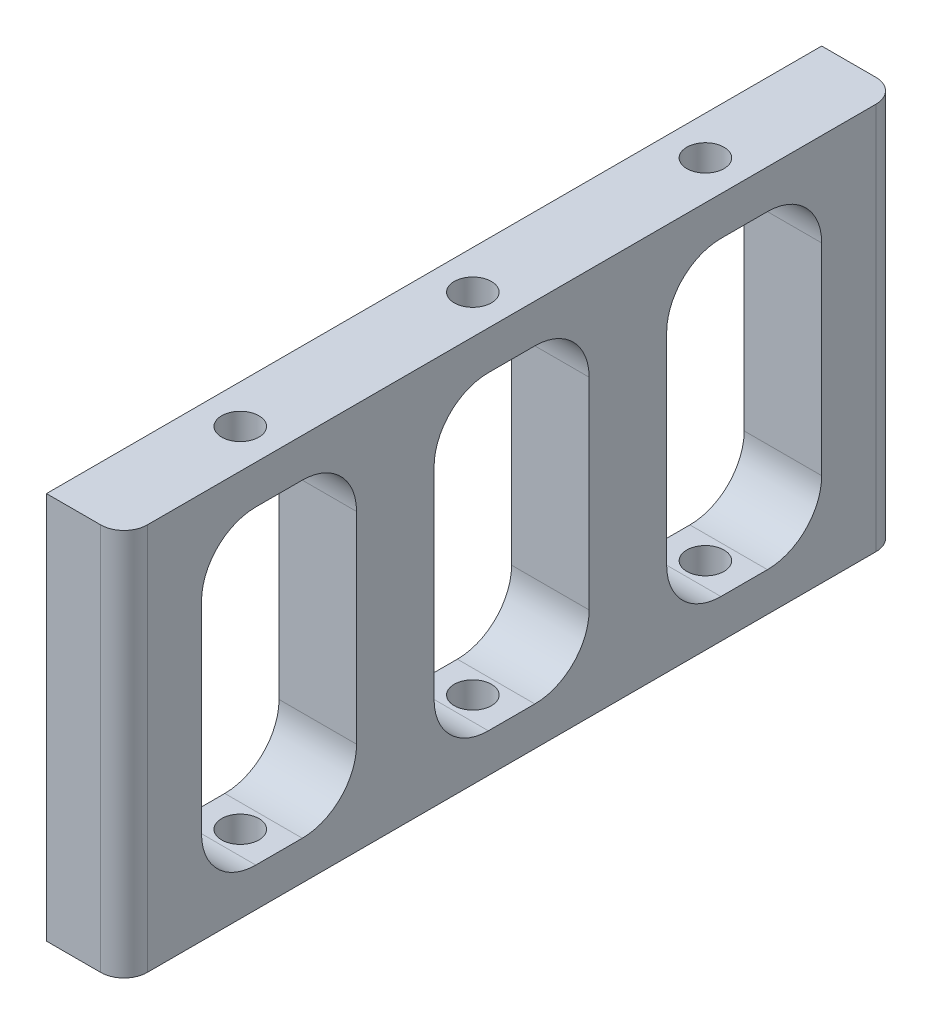
ISO-10303-21;
HEADER;
FILE_DESCRIPTION(('STEP AP214'),'2;1');
FILE_NAME('part.step','',(''),(''),'','','');
FILE_SCHEMA(('AUTOMOTIVE_DESIGN { 1 0 10303 214 1 1 1 1 }'));
ENDSEC;
DATA;
#1=APPLICATION_CONTEXT('core data for automotive mechanical design processes');
#2=APPLICATION_PROTOCOL_DEFINITION('international standard','automotive_design',2000,#1);
#3=PRODUCT_CONTEXT('',#1,'mechanical');
#4=PRODUCT('Part','Part','',(#3));
#5=PRODUCT_RELATED_PRODUCT_CATEGORY('part','',(#4));
#6=PRODUCT_DEFINITION_FORMATION('','',#4);
#7=PRODUCT_DEFINITION_CONTEXT('part definition',#1,'design');
#8=PRODUCT_DEFINITION('design','',#6,#7);
#9=PRODUCT_DEFINITION_SHAPE('','',#8);
#10=(LENGTH_UNIT() NAMED_UNIT(*) SI_UNIT(.MILLI.,.METRE.));
#11=(NAMED_UNIT(*) PLANE_ANGLE_UNIT() SI_UNIT($,.RADIAN.));
#12=(NAMED_UNIT(*) SI_UNIT($,.STERADIAN.) SOLID_ANGLE_UNIT());
#13=UNCERTAINTY_MEASURE_WITH_UNIT(LENGTH_MEASURE(1.E-05),#10,'distance_accuracy_value','');
#14=(GEOMETRIC_REPRESENTATION_CONTEXT(3) GLOBAL_UNCERTAINTY_ASSIGNED_CONTEXT((#13)) GLOBAL_UNIT_ASSIGNED_CONTEXT((#10,
#11,#12)) REPRESENTATION_CONTEXT('',''));
#15=CARTESIAN_POINT('',(0.,0.,0.));
#16=DIRECTION('',(0.,0.,1.));
#17=DIRECTION('',(1.,0.,0.));
#18=AXIS2_PLACEMENT_3D('',#15,#16,#17);
#19=CARTESIAN_POINT('',(10.,50.,0.));
#20=DIRECTION('',(0.,1.,0.));
#21=DIRECTION('',(0.,0.,1.));
#22=AXIS2_PLACEMENT_3D('',#19,#20,#21);
#23=PLANE('',#22);
#24=CARTESIAN_POINT('',(5.,50.,-20.));
#25=DIRECTION('',(0.,-1.,0.));
#26=DIRECTION('',(0.,0.,-1.));
#27=AXIS2_PLACEMENT_3D('',#24,#25,#26);
#28=CIRCLE('',#27,2.4);
#29=CARTESIAN_POINT('',(5.,50.,-22.4));
#30=VERTEX_POINT('',#29);
#31=EDGE_CURVE('E292',#30,#30,#28,.T.);
#32=ORIENTED_EDGE('',*,*,#31,.T.);
#33=EDGE_LOOP('',(#32));
#34=FACE_BOUND('',#33,.T.);
#35=CARTESIAN_POINT('',(5.,50.,-50.));
#36=DIRECTION('',(0.,-1.,0.));
#37=DIRECTION('',(0.,0.,-1.));
#38=AXIS2_PLACEMENT_3D('',#35,#36,#37);
#39=CIRCLE('',#38,2.4);
#40=CARTESIAN_POINT('',(5.,50.,-52.4));
#41=VERTEX_POINT('',#40);
#42=EDGE_CURVE('E1108',#41,#41,#39,.T.);
#43=ORIENTED_EDGE('',*,*,#42,.T.);
#44=EDGE_LOOP('',(#43));
#45=FACE_BOUND('',#44,.T.);
#46=CARTESIAN_POINT('',(5.00000000000003,50.,-80.));
#47=DIRECTION('',(0.,-1.,0.));
#48=DIRECTION('',(0.,0.,-1.));
#49=AXIS2_PLACEMENT_3D('',#46,#47,#48);
#50=CIRCLE('',#49,2.39999999999997);
#51=CARTESIAN_POINT('',(5.00000000000003,50.,-82.4));
#52=VERTEX_POINT('',#51);
#53=EDGE_CURVE('E1118',#52,#52,#50,.T.);
#54=ORIENTED_EDGE('',*,*,#53,.T.);
#55=EDGE_LOOP('',(#54));
#56=FACE_BOUND('',#55,.T.);
#57=DIRECTION('',(0.,0.,-1.));
#58=VECTOR('',#57,1.);
#59=CARTESIAN_POINT('',(10.,50.,0.));
#60=LINE('',#59,#58);
#61=CARTESIAN_POINT('',(10.,50.,-3.));
#62=VERTEX_POINT('',#61);
#63=CARTESIAN_POINT('',(10.,50.,-97.));
#64=VERTEX_POINT('',#63);
#65=EDGE_CURVE('E485',#62,#64,#60,.T.);
#66=ORIENTED_EDGE('',*,*,#65,.T.);
#67=CARTESIAN_POINT('',(7.,50.,-97.));
#68=DIRECTION('',(0.,1.,0.));
#69=DIRECTION('',(0.,0.,1.));
#70=AXIS2_PLACEMENT_3D('',#67,#68,#69);
#71=CIRCLE('',#70,3.);
#72=CARTESIAN_POINT('',(7.,50.,-100.));
#73=VERTEX_POINT('',#72);
#74=EDGE_CURVE('E468',#64,#73,#71,.T.);
#75=ORIENTED_EDGE('',*,*,#74,.T.);
#76=DIRECTION('',(-1.,0.,0.));
#77=VECTOR('',#76,1.);
#78=CARTESIAN_POINT('',(10.,50.,-100.));
#79=LINE('',#78,#77);
#80=CARTESIAN_POINT('',(0.,50.,-100.));
#81=VERTEX_POINT('',#80);
#82=EDGE_CURVE('E258',#73,#81,#79,.T.);
#83=ORIENTED_EDGE('',*,*,#82,.T.);
#84=DIRECTION('',(0.,0.,-1.));
#85=VECTOR('',#84,1.);
#86=CARTESIAN_POINT('',(0.,50.,0.));
#87=LINE('',#86,#85);
#88=CARTESIAN_POINT('',(0.,50.,0.));
#89=VERTEX_POINT('',#88);
#90=EDGE_CURVE('E256',#89,#81,#87,.T.);
#91=ORIENTED_EDGE('',*,*,#90,.F.);
#92=DIRECTION('',(-1.,0.,0.));
#93=VECTOR('',#92,1.);
#94=CARTESIAN_POINT('',(10.,50.,0.));
#95=LINE('',#94,#93);
#96=CARTESIAN_POINT('',(7.,50.,0.));
#97=VERTEX_POINT('',#96);
#98=EDGE_CURVE('E244',#97,#89,#95,.T.);
#99=ORIENTED_EDGE('',*,*,#98,.F.);
#100=CARTESIAN_POINT('',(7.,50.,-3.));
#101=DIRECTION('',(0.,1.,0.));
#102=DIRECTION('',(0.,0.,1.));
#103=AXIS2_PLACEMENT_3D('',#100,#101,#102);
#104=CIRCLE('',#103,3.);
#105=EDGE_CURVE('E465',#97,#62,#104,.T.);
#106=ORIENTED_EDGE('',*,*,#105,.T.);
#107=EDGE_LOOP('',(#66,#75,#83,#91,#99,#106));
#108=FACE_BOUND('',#107,.T.);
#109=ADVANCED_FACE('F44',(#34,#45,#56,#108),#23,.T.);
#110=CARTESIAN_POINT('',(10.,0.,0.));
#111=DIRECTION('',(0.,0.,1.));
#112=DIRECTION('',(1.,0.,0.));
#113=AXIS2_PLACEMENT_3D('',#110,#111,#112);
#114=PLANE('',#113);
#115=DIRECTION('',(-1.,0.,0.));
#116=VECTOR('',#115,1.);
#117=CARTESIAN_POINT('',(10.,0.,0.));
#118=LINE('',#117,#116);
#119=CARTESIAN_POINT('',(7.,0.,0.));
#120=VERTEX_POINT('',#119);
#121=CARTESIAN_POINT('',(0.,0.,0.));
#122=VERTEX_POINT('',#121);
#123=EDGE_CURVE('E253',#120,#122,#118,.T.);
#124=ORIENTED_EDGE('',*,*,#123,.F.);
#125=DIRECTION('',(0.,1.,0.));
#126=VECTOR('',#125,1.);
#127=CARTESIAN_POINT('',(7.,0.,0.));
#128=LINE('',#127,#126);
#129=EDGE_CURVE('E11',#120,#97,#128,.T.);
#130=ORIENTED_EDGE('',*,*,#129,.T.);
#131=ORIENTED_EDGE('',*,*,#98,.T.);
#132=DIRECTION('',(0.,1.,0.));
#133=VECTOR('',#132,1.);
#134=CARTESIAN_POINT('',(0.,0.,0.));
#135=LINE('',#134,#133);
#136=EDGE_CURVE('E248',#122,#89,#135,.T.);
#137=ORIENTED_EDGE('',*,*,#136,.F.);
#138=EDGE_LOOP('',(#124,#130,#131,#137));
#139=FACE_BOUND('',#138,.T.);
#140=ADVANCED_FACE('F246',(#139),#114,.T.);
#141=CARTESIAN_POINT('',(10.,0.,0.));
#142=DIRECTION('',(0.,1.,0.));
#143=DIRECTION('',(0.,0.,1.));
#144=AXIS2_PLACEMENT_3D('',#141,#142,#143);
#145=PLANE('',#144);
#146=CARTESIAN_POINT('',(5.,0.,-20.));
#147=DIRECTION('',(0.,-1.,0.));
#148=DIRECTION('',(0.,0.,-1.));
#149=AXIS2_PLACEMENT_3D('',#146,#147,#148);
#150=CIRCLE('',#149,2.4);
#151=CARTESIAN_POINT('',(5.,0.,-22.4));
#152=VERTEX_POINT('',#151);
#153=EDGE_CURVE('E1100',#152,#152,#150,.T.);
#154=ORIENTED_EDGE('',*,*,#153,.F.);
#155=EDGE_LOOP('',(#154));
#156=FACE_BOUND('',#155,.T.);
#157=CARTESIAN_POINT('',(5.,0.,-50.));
#158=DIRECTION('',(0.,-1.,0.));
#159=DIRECTION('',(0.,0.,-1.));
#160=AXIS2_PLACEMENT_3D('',#157,#158,#159);
#161=CIRCLE('',#160,2.4);
#162=CARTESIAN_POINT('',(5.,0.,-52.4));
#163=VERTEX_POINT('',#162);
#164=EDGE_CURVE('E1102',#163,#163,#161,.T.);
#165=ORIENTED_EDGE('',*,*,#164,.F.);
#166=EDGE_LOOP('',(#165));
#167=FACE_BOUND('',#166,.T.);
#168=CARTESIAN_POINT('',(5.00000000000003,0.,-80.));
#169=DIRECTION('',(0.,-1.,0.));
#170=DIRECTION('',(0.,0.,-1.));
#171=AXIS2_PLACEMENT_3D('',#168,#169,#170);
#172=CIRCLE('',#171,2.39999999999997);
#173=CARTESIAN_POINT('',(5.00000000000003,0.,-82.4));
#174=VERTEX_POINT('',#173);
#175=EDGE_CURVE('E1114',#174,#174,#172,.T.);
#176=ORIENTED_EDGE('',*,*,#175,.F.);
#177=EDGE_LOOP('',(#176));
#178=FACE_BOUND('',#177,.T.);
#179=DIRECTION('',(-1.,0.,0.));
#180=VECTOR('',#179,1.);
#181=CARTESIAN_POINT('',(10.,0.,-100.));
#182=LINE('',#181,#180);
#183=CARTESIAN_POINT('',(7.,0.,-100.));
#184=VERTEX_POINT('',#183);
#185=CARTESIAN_POINT('',(0.,0.,-100.));
#186=VERTEX_POINT('',#185);
#187=EDGE_CURVE('E281',#184,#186,#182,.T.);
#188=ORIENTED_EDGE('',*,*,#187,.F.);
#189=CARTESIAN_POINT('',(7.,0.,-97.));
#190=DIRECTION('',(0.,1.,0.));
#191=DIRECTION('',(0.,0.,1.));
#192=AXIS2_PLACEMENT_3D('',#189,#190,#191);
#193=CIRCLE('',#192,3.);
#194=CARTESIAN_POINT('',(10.,0.,-97.));
#195=VERTEX_POINT('',#194);
#196=EDGE_CURVE('E53',#184,#195,#193,.F.);
#197=ORIENTED_EDGE('',*,*,#196,.T.);
#198=DIRECTION('',(0.,0.,-1.));
#199=VECTOR('',#198,1.);
#200=CARTESIAN_POINT('',(10.,0.,0.));
#201=LINE('',#200,#199);
#202=CARTESIAN_POINT('',(10.,0.,-3.));
#203=VERTEX_POINT('',#202);
#204=EDGE_CURVE('E282',#203,#195,#201,.T.);
#205=ORIENTED_EDGE('',*,*,#204,.F.);
#206=CARTESIAN_POINT('',(7.,0.,-3.));
#207=DIRECTION('',(0.,1.,0.));
#208=DIRECTION('',(0.,0.,1.));
#209=AXIS2_PLACEMENT_3D('',#206,#207,#208);
#210=CIRCLE('',#209,3.);
#211=EDGE_CURVE('E60',#203,#120,#210,.F.);
#212=ORIENTED_EDGE('',*,*,#211,.T.);
#213=ORIENTED_EDGE('',*,*,#123,.T.);
#214=DIRECTION('',(0.,0.,-1.));
#215=VECTOR('',#214,1.);
#216=CARTESIAN_POINT('',(0.,0.,0.));
#217=LINE('',#216,#215);
#218=EDGE_CURVE('E268',#122,#186,#217,.T.);
#219=ORIENTED_EDGE('',*,*,#218,.T.);
#220=EDGE_LOOP('',(#188,#197,#205,#212,#213,#219));
#221=FACE_BOUND('',#220,.T.);
#222=ADVANCED_FACE('F477',(#156,#167,#178,#221),#145,.F.);
#223=CARTESIAN_POINT('',(10.,5.,0.));
#224=DIRECTION('',(0.,1.,0.));
#225=DIRECTION('',(0.,0.,1.));
#226=AXIS2_PLACEMENT_3D('',#223,#224,#225);
#227=PLANE('',#226);
#228=CARTESIAN_POINT('',(5.,5.,-20.));
#229=DIRECTION('',(0.,1.,0.));
#230=DIRECTION('',(0.,0.,1.));
#231=AXIS2_PLACEMENT_3D('',#228,#229,#230);
#232=CIRCLE('',#231,2.4);
#233=CARTESIAN_POINT('',(5.,5.,-17.6));
#234=VERTEX_POINT('',#233);
#235=EDGE_CURVE('E302',#234,#234,#232,.T.);
#236=ORIENTED_EDGE('',*,*,#235,.F.);
#237=EDGE_LOOP('',(#236));
#238=FACE_BOUND('',#237,.T.);
#239=DIRECTION('',(0.,0.,-1.));
#240=VECTOR('',#239,1.);
#241=CARTESIAN_POINT('',(10.,5.,0.));
#242=LINE('',#241,#240);
#243=CARTESIAN_POINT('',(10.,5.,-17.));
#244=VERTEX_POINT('',#243);
#245=CARTESIAN_POINT('',(10.,5.,-23.));
#246=VERTEX_POINT('',#245);
#247=EDGE_CURVE('E546',#244,#246,#242,.T.);
#248=ORIENTED_EDGE('',*,*,#247,.T.);
#249=DIRECTION('',(-1.,0.,0.));
#250=VECTOR('',#249,1.);
#251=CARTESIAN_POINT('',(10.,5.,-23.));
#252=LINE('',#251,#250);
#253=CARTESIAN_POINT('',(0.,5.,-23.));
#254=VERTEX_POINT('',#253);
#255=EDGE_CURVE('E319',#246,#254,#252,.T.);
#256=ORIENTED_EDGE('',*,*,#255,.T.);
#257=DIRECTION('',(0.,0.,-1.));
#258=VECTOR('',#257,1.);
#259=CARTESIAN_POINT('',(0.,5.,0.));
#260=LINE('',#259,#258);
#261=CARTESIAN_POINT('',(0.,5.,-17.));
#262=VERTEX_POINT('',#261);
#263=EDGE_CURVE('E505',#262,#254,#260,.T.);
#264=ORIENTED_EDGE('',*,*,#263,.F.);
#265=DIRECTION('',(-1.,0.,0.));
#266=VECTOR('',#265,1.);
#267=CARTESIAN_POINT('',(10.,5.,-17.));
#268=LINE('',#267,#266);
#269=EDGE_CURVE('E316',#262,#244,#268,.F.);
#270=ORIENTED_EDGE('',*,*,#269,.T.);
#271=EDGE_LOOP('',(#248,#256,#264,#270));
#272=FACE_BOUND('',#271,.T.);
#273=ADVANCED_FACE('F549',(#238,#272),#227,.T.);
#274=CARTESIAN_POINT('',(10.,0.,-9.99999999999999));
#275=DIRECTION('',(0.,0.,-1.));
#276=DIRECTION('',(0.,1.,0.));
#277=AXIS2_PLACEMENT_3D('',#274,#275,#276);
#278=PLANE('',#277);
#279=DIRECTION('',(0.,-1.,0.));
#280=VECTOR('',#279,1.);
#281=CARTESIAN_POINT('',(10.,0.,-9.99999999999999));
#282=LINE('',#281,#280);
#283=CARTESIAN_POINT('',(10.,38.,-9.99999999999999));
#284=VERTEX_POINT('',#283);
#285=CARTESIAN_POINT('',(10.,12.,-9.99999999999999));
#286=VERTEX_POINT('',#285);
#287=EDGE_CURVE('E554',#284,#286,#282,.T.);
#288=ORIENTED_EDGE('',*,*,#287,.T.);
#289=DIRECTION('',(-1.,0.,0.));
#290=VECTOR('',#289,1.);
#291=CARTESIAN_POINT('',(0.,12.,-9.99999999999999));
#292=LINE('',#291,#290);
#293=CARTESIAN_POINT('',(0.,12.,-9.99999999999999));
#294=VERTEX_POINT('',#293);
#295=EDGE_CURVE('E375',#286,#294,#292,.T.);
#296=ORIENTED_EDGE('',*,*,#295,.T.);
#297=DIRECTION('',(0.,-1.,0.));
#298=VECTOR('',#297,1.);
#299=CARTESIAN_POINT('',(0.,0.,-9.99999999999999));
#300=LINE('',#299,#298);
#301=CARTESIAN_POINT('',(0.,38.,-9.99999999999999));
#302=VERTEX_POINT('',#301);
#303=EDGE_CURVE('E516',#302,#294,#300,.T.);
#304=ORIENTED_EDGE('',*,*,#303,.F.);
#305=DIRECTION('',(-1.,0.,0.));
#306=VECTOR('',#305,1.);
#307=CARTESIAN_POINT('',(10.,38.,-9.99999999999999));
#308=LINE('',#307,#306);
#309=EDGE_CURVE('E372',#302,#284,#308,.F.);
#310=ORIENTED_EDGE('',*,*,#309,.T.);
#311=EDGE_LOOP('',(#288,#296,#304,#310));
#312=FACE_BOUND('',#311,.T.);
#313=ADVANCED_FACE('F622',(#312),#278,.T.);
#314=CARTESIAN_POINT('',(10.,45.,0.));
#315=DIRECTION('',(0.,1.,0.));
#316=DIRECTION('',(0.,0.,1.));
#317=AXIS2_PLACEMENT_3D('',#314,#315,#316);
#318=PLANE('',#317);
#319=CARTESIAN_POINT('',(5.,45.,-20.));
#320=DIRECTION('',(0.,1.,0.));
#321=DIRECTION('',(0.,0.,1.));
#322=AXIS2_PLACEMENT_3D('',#319,#320,#321);
#323=CIRCLE('',#322,2.4);
#324=CARTESIAN_POINT('',(5.,45.,-17.6));
#325=VERTEX_POINT('',#324);
#326=EDGE_CURVE('E298',#325,#325,#323,.T.);
#327=ORIENTED_EDGE('',*,*,#326,.T.);
#328=EDGE_LOOP('',(#327));
#329=FACE_BOUND('',#328,.T.);
#330=DIRECTION('',(0.,0.,-1.));
#331=VECTOR('',#330,1.);
#332=CARTESIAN_POINT('',(10.,45.,0.));
#333=LINE('',#332,#331);
#334=CARTESIAN_POINT('',(10.,45.,-17.));
#335=VERTEX_POINT('',#334);
#336=CARTESIAN_POINT('',(10.,45.,-23.));
#337=VERTEX_POINT('',#336);
#338=EDGE_CURVE('E495',#335,#337,#333,.T.);
#339=ORIENTED_EDGE('',*,*,#338,.F.);
#340=DIRECTION('',(-1.,0.,0.));
#341=VECTOR('',#340,1.);
#342=CARTESIAN_POINT('',(10.,45.,-17.));
#343=LINE('',#342,#341);
#344=CARTESIAN_POINT('',(0.,45.,-17.));
#345=VERTEX_POINT('',#344);
#346=EDGE_CURVE('E382',#335,#345,#343,.T.);
#347=ORIENTED_EDGE('',*,*,#346,.T.);
#348=DIRECTION('',(0.,0.,-1.));
#349=VECTOR('',#348,1.);
#350=CARTESIAN_POINT('',(0.,45.,0.));
#351=LINE('',#350,#349);
#352=CARTESIAN_POINT('',(0.,45.,-23.));
#353=VERTEX_POINT('',#352);
#354=EDGE_CURVE('E512',#345,#353,#351,.T.);
#355=ORIENTED_EDGE('',*,*,#354,.T.);
#356=DIRECTION('',(-1.,0.,0.));
#357=VECTOR('',#356,1.);
#358=CARTESIAN_POINT('',(10.,45.,-23.));
#359=LINE('',#358,#357);
#360=EDGE_CURVE('E379',#353,#337,#359,.F.);
#361=ORIENTED_EDGE('',*,*,#360,.T.);
#362=EDGE_LOOP('',(#339,#347,#355,#361));
#363=FACE_BOUND('',#362,.T.);
#364=ADVANCED_FACE('F631',(#329,#363),#318,.F.);
#365=CARTESIAN_POINT('',(5.00000000000003,5.,-80.));
#366=DIRECTION('',(0.,1.,0.));
#367=DIRECTION('',(0.,0.,1.));
#368=AXIS2_PLACEMENT_3D('',#365,#366,#367);
#369=CIRCLE('',#368,2.39999999999997);
#370=CARTESIAN_POINT('',(5.00000000000003,5.,-77.6));
#371=VERTEX_POINT('',#370);
#372=EDGE_CURVE('E297',#371,#371,#369,.T.);
#373=ORIENTED_EDGE('',*,*,#372,.F.);
#374=EDGE_LOOP('',(#373));
#375=FACE_BOUND('',#374,.T.);
#376=CARTESIAN_POINT('',(10.,5.,-77.));
#377=VERTEX_POINT('',#376);
#378=CARTESIAN_POINT('',(10.,5.,-83.));
#379=VERTEX_POINT('',#378);
#380=EDGE_CURVE('E557',#377,#379,#242,.T.);
#381=ORIENTED_EDGE('',*,*,#380,.T.);
#382=DIRECTION('',(-1.,0.,0.));
#383=VECTOR('',#382,1.);
#384=CARTESIAN_POINT('',(10.,5.,-83.));
#385=LINE('',#384,#383);
#386=CARTESIAN_POINT('',(0.,5.,-83.));
#387=VERTEX_POINT('',#386);
#388=EDGE_CURVE('E347',#379,#387,#385,.T.);
#389=ORIENTED_EDGE('',*,*,#388,.T.);
#390=CARTESIAN_POINT('',(0.,5.,-77.));
#391=VERTEX_POINT('',#390);
#392=EDGE_CURVE('E499',#391,#387,#260,.T.);
#393=ORIENTED_EDGE('',*,*,#392,.F.);
#394=DIRECTION('',(-1.,0.,0.));
#395=VECTOR('',#394,1.);
#396=CARTESIAN_POINT('',(10.,5.,-77.));
#397=LINE('',#396,#395);
#398=EDGE_CURVE('E344',#391,#377,#397,.F.);
#399=ORIENTED_EDGE('',*,*,#398,.T.);
#400=EDGE_LOOP('',(#381,#389,#393,#399));
#401=FACE_BOUND('',#400,.T.);
#402=ADVANCED_FACE('F660',(#375,#401),#227,.T.);
#403=CARTESIAN_POINT('',(10.,0.,-70.));
#404=DIRECTION('',(0.,0.,-1.));
#405=DIRECTION('',(-1.,0.,0.));
#406=AXIS2_PLACEMENT_3D('',#403,#404,#405);
#407=PLANE('',#406);
#408=DIRECTION('',(0.,-1.,0.));
#409=VECTOR('',#408,1.);
#410=CARTESIAN_POINT('',(10.,0.,-70.));
#411=LINE('',#410,#409);
#412=CARTESIAN_POINT('',(10.,38.,-70.));
#413=VERTEX_POINT('',#412);
#414=CARTESIAN_POINT('',(10.,12.,-70.));
#415=VERTEX_POINT('',#414);
#416=EDGE_CURVE('E571',#413,#415,#411,.T.);
#417=ORIENTED_EDGE('',*,*,#416,.T.);
#418=DIRECTION('',(-1.,0.,0.));
#419=VECTOR('',#418,1.);
#420=CARTESIAN_POINT('',(0.,12.,-70.));
#421=LINE('',#420,#419);
#422=CARTESIAN_POINT('',(0.,12.,-70.));
#423=VERTEX_POINT('',#422);
#424=EDGE_CURVE('E354',#415,#423,#421,.T.);
#425=ORIENTED_EDGE('',*,*,#424,.T.);
#426=DIRECTION('',(0.,-1.,0.));
#427=VECTOR('',#426,1.);
#428=CARTESIAN_POINT('',(0.,0.,-70.));
#429=LINE('',#428,#427);
#430=CARTESIAN_POINT('',(0.,38.,-70.));
#431=VERTEX_POINT('',#430);
#432=EDGE_CURVE('E503',#431,#423,#429,.T.);
#433=ORIENTED_EDGE('',*,*,#432,.F.);
#434=DIRECTION('',(-1.,0.,0.));
#435=VECTOR('',#434,1.);
#436=CARTESIAN_POINT('',(10.,38.,-70.));
#437=LINE('',#436,#435);
#438=EDGE_CURVE('E351',#431,#413,#437,.F.);
#439=ORIENTED_EDGE('',*,*,#438,.T.);
#440=EDGE_LOOP('',(#417,#425,#433,#439));
#441=FACE_BOUND('',#440,.T.);
#442=ADVANCED_FACE('F672',(#441),#407,.T.);
#443=CARTESIAN_POINT('',(5.00000000000003,45.,-80.));
#444=DIRECTION('',(0.,1.,0.));
#445=DIRECTION('',(0.,0.,1.));
#446=AXIS2_PLACEMENT_3D('',#443,#444,#445);
#447=CIRCLE('',#446,2.39999999999997);
#448=CARTESIAN_POINT('',(5.00000000000003,45.,-77.6));
#449=VERTEX_POINT('',#448);
#450=EDGE_CURVE('E293',#449,#449,#447,.T.);
#451=ORIENTED_EDGE('',*,*,#450,.T.);
#452=EDGE_LOOP('',(#451));
#453=FACE_BOUND('',#452,.T.);
#454=CARTESIAN_POINT('',(0.,45.,-77.));
#455=VERTEX_POINT('',#454);
#456=CARTESIAN_POINT('',(0.,45.,-83.));
#457=VERTEX_POINT('',#456);
#458=EDGE_CURVE('E517',#455,#457,#351,.T.);
#459=ORIENTED_EDGE('',*,*,#458,.T.);
#460=DIRECTION('',(-1.,0.,0.));
#461=VECTOR('',#460,1.);
#462=CARTESIAN_POINT('',(10.,45.,-83.));
#463=LINE('',#462,#461);
#464=CARTESIAN_POINT('',(10.,45.,-83.));
#465=VERTEX_POINT('',#464);
#466=EDGE_CURVE('E341',#457,#465,#463,.F.);
#467=ORIENTED_EDGE('',*,*,#466,.T.);
#468=CARTESIAN_POINT('',(10.,45.,-77.));
#469=VERTEX_POINT('',#468);
#470=EDGE_CURVE('E562',#469,#465,#333,.T.);
#471=ORIENTED_EDGE('',*,*,#470,.F.);
#472=DIRECTION('',(-1.,0.,0.));
#473=VECTOR('',#472,1.);
#474=CARTESIAN_POINT('',(10.,45.,-77.));
#475=LINE('',#474,#473);
#476=EDGE_CURVE('E337',#469,#455,#475,.T.);
#477=ORIENTED_EDGE('',*,*,#476,.T.);
#478=EDGE_LOOP('',(#459,#467,#471,#477));
#479=FACE_BOUND('',#478,.T.);
#480=ADVANCED_FACE('F662',(#453,#479),#318,.F.);
#481=CARTESIAN_POINT('',(5.,5.,-50.));
#482=DIRECTION('',(0.,1.,0.));
#483=DIRECTION('',(0.,0.,1.));
#484=AXIS2_PLACEMENT_3D('',#481,#482,#483);
#485=CIRCLE('',#484,2.4);
#486=CARTESIAN_POINT('',(5.,5.,-47.6));
#487=VERTEX_POINT('',#486);
#488=EDGE_CURVE('E291',#487,#487,#485,.T.);
#489=ORIENTED_EDGE('',*,*,#488,.F.);
#490=EDGE_LOOP('',(#489));
#491=FACE_BOUND('',#490,.T.);
#492=CARTESIAN_POINT('',(0.,5.,-47.));
#493=VERTEX_POINT('',#492);
#494=CARTESIAN_POINT('',(0.,5.,-53.));
#495=VERTEX_POINT('',#494);
#496=EDGE_CURVE('E506',#493,#495,#260,.T.);
#497=ORIENTED_EDGE('',*,*,#496,.F.);
#498=DIRECTION('',(-1.,0.,0.));
#499=VECTOR('',#498,1.);
#500=CARTESIAN_POINT('',(10.,5.,-47.));
#501=LINE('',#500,#499);
#502=CARTESIAN_POINT('',(10.,5.,-47.));
#503=VERTEX_POINT('',#502);
#504=EDGE_CURVE('E313',#493,#503,#501,.F.);
#505=ORIENTED_EDGE('',*,*,#504,.T.);
#506=CARTESIAN_POINT('',(10.,5.,-53.));
#507=VERTEX_POINT('',#506);
#508=EDGE_CURVE('E278',#503,#507,#242,.T.);
#509=ORIENTED_EDGE('',*,*,#508,.T.);
#510=DIRECTION('',(-1.,0.,0.));
#511=VECTOR('',#510,1.);
#512=CARTESIAN_POINT('',(10.,5.,-53.));
#513=LINE('',#512,#511);
#514=EDGE_CURVE('E309',#507,#495,#513,.T.);
#515=ORIENTED_EDGE('',*,*,#514,.T.);
#516=EDGE_LOOP('',(#497,#505,#509,#515));
#517=FACE_BOUND('',#516,.T.);
#518=ADVANCED_FACE('F609',(#491,#517),#227,.T.);
#519=CARTESIAN_POINT('',(10.,0.,-40.));
#520=DIRECTION('',(0.,0.,-1.));
#521=DIRECTION('',(-1.,0.,0.));
#522=AXIS2_PLACEMENT_3D('',#519,#520,#521);
#523=PLANE('',#522);
#524=DIRECTION('',(0.,-1.,0.));
#525=VECTOR('',#524,1.);
#526=CARTESIAN_POINT('',(10.,0.,-40.));
#527=LINE('',#526,#525);
#528=CARTESIAN_POINT('',(10.,38.,-40.));
#529=VERTEX_POINT('',#528);
#530=CARTESIAN_POINT('',(10.,12.,-40.));
#531=VERTEX_POINT('',#530);
#532=EDGE_CURVE('E568',#529,#531,#527,.T.);
#533=ORIENTED_EDGE('',*,*,#532,.T.);
#534=DIRECTION('',(-1.,0.,0.));
#535=VECTOR('',#534,1.);
#536=CARTESIAN_POINT('',(0.,12.,-40.));
#537=LINE('',#536,#535);
#538=CARTESIAN_POINT('',(0.,12.,-40.));
#539=VERTEX_POINT('',#538);
#540=EDGE_CURVE('E305',#531,#539,#537,.T.);
#541=ORIENTED_EDGE('',*,*,#540,.T.);
#542=DIRECTION('',(0.,-1.,0.));
#543=VECTOR('',#542,1.);
#544=CARTESIAN_POINT('',(0.,0.,-40.));
#545=LINE('',#544,#543);
#546=CARTESIAN_POINT('',(0.,38.,-40.));
#547=VERTEX_POINT('',#546);
#548=EDGE_CURVE('E507',#547,#539,#545,.T.);
#549=ORIENTED_EDGE('',*,*,#548,.F.);
#550=DIRECTION('',(-1.,0.,0.));
#551=VECTOR('',#550,1.);
#552=CARTESIAN_POINT('',(10.,38.,-40.));
#553=LINE('',#552,#551);
#554=EDGE_CURVE('E252',#547,#529,#553,.F.);
#555=ORIENTED_EDGE('',*,*,#554,.T.);
#556=EDGE_LOOP('',(#533,#541,#549,#555));
#557=FACE_BOUND('',#556,.T.);
#558=ADVANCED_FACE('F596',(#557),#523,.T.);
#559=CARTESIAN_POINT('',(5.,45.,-50.));
#560=DIRECTION('',(0.,1.,0.));
#561=DIRECTION('',(0.,0.,1.));
#562=AXIS2_PLACEMENT_3D('',#559,#560,#561);
#563=CIRCLE('',#562,2.4);
#564=CARTESIAN_POINT('',(5.,45.,-47.6));
#565=VERTEX_POINT('',#564);
#566=EDGE_CURVE('E287',#565,#565,#563,.T.);
#567=ORIENTED_EDGE('',*,*,#566,.T.);
#568=EDGE_LOOP('',(#567));
#569=FACE_BOUND('',#568,.T.);
#570=CARTESIAN_POINT('',(0.,45.,-47.));
#571=VERTEX_POINT('',#570);
#572=CARTESIAN_POINT('',(0.,45.,-53.));
#573=VERTEX_POINT('',#572);
#574=EDGE_CURVE('E511',#571,#573,#351,.T.);
#575=ORIENTED_EDGE('',*,*,#574,.T.);
#576=DIRECTION('',(-1.,0.,0.));
#577=VECTOR('',#576,1.);
#578=CARTESIAN_POINT('',(10.,45.,-53.));
#579=LINE('',#578,#577);
#580=CARTESIAN_POINT('',(10.,45.,-53.));
#581=VERTEX_POINT('',#580);
#582=EDGE_CURVE('E369',#573,#581,#579,.F.);
#583=ORIENTED_EDGE('',*,*,#582,.T.);
#584=CARTESIAN_POINT('',(10.,45.,-47.));
#585=VERTEX_POINT('',#584);
#586=EDGE_CURVE('E581',#585,#581,#333,.T.);
#587=ORIENTED_EDGE('',*,*,#586,.F.);
#588=DIRECTION('',(-1.,0.,0.));
#589=VECTOR('',#588,1.);
#590=CARTESIAN_POINT('',(10.,45.,-47.));
#591=LINE('',#590,#589);
#592=EDGE_CURVE('E365',#585,#571,#591,.T.);
#593=ORIENTED_EDGE('',*,*,#592,.T.);
#594=EDGE_LOOP('',(#575,#583,#587,#593));
#595=FACE_BOUND('',#594,.T.);
#596=ADVANCED_FACE('F657',(#569,#595),#318,.F.);
#597=CARTESIAN_POINT('',(10.,0.,-30.));
#598=DIRECTION('',(0.,0.,-1.));
#599=DIRECTION('',(0.,1.,0.));
#600=AXIS2_PLACEMENT_3D('',#597,#598,#599);
#601=PLANE('',#600);
#602=DIRECTION('',(0.,-1.,0.));
#603=VECTOR('',#602,1.);
#604=CARTESIAN_POINT('',(0.,0.,-30.));
#605=LINE('',#604,#603);
#606=CARTESIAN_POINT('',(0.,38.,-30.));
#607=VERTEX_POINT('',#606);
#608=CARTESIAN_POINT('',(0.,12.,-30.));
#609=VERTEX_POINT('',#608);
#610=EDGE_CURVE('E263',#607,#609,#605,.T.);
#611=ORIENTED_EDGE('',*,*,#610,.T.);
#612=DIRECTION('',(-1.,0.,0.));
#613=VECTOR('',#612,1.);
#614=CARTESIAN_POINT('',(10.,12.,-30.));
#615=LINE('',#614,#613);
#616=CARTESIAN_POINT('',(10.,12.,-30.));
#617=VERTEX_POINT('',#616);
#618=EDGE_CURVE('E327',#609,#617,#615,.F.);
#619=ORIENTED_EDGE('',*,*,#618,.T.);
#620=DIRECTION('',(0.,-1.,0.));
#621=VECTOR('',#620,1.);
#622=CARTESIAN_POINT('',(10.,0.,-30.));
#623=LINE('',#622,#621);
#624=CARTESIAN_POINT('',(10.,38.,-30.));
#625=VERTEX_POINT('',#624);
#626=EDGE_CURVE('E491',#625,#617,#623,.T.);
#627=ORIENTED_EDGE('',*,*,#626,.F.);
#628=DIRECTION('',(-1.,0.,0.));
#629=VECTOR('',#628,1.);
#630=CARTESIAN_POINT('',(0.,38.,-30.));
#631=LINE('',#630,#629);
#632=EDGE_CURVE('E323',#625,#607,#631,.T.);
#633=ORIENTED_EDGE('',*,*,#632,.T.);
#634=EDGE_LOOP('',(#611,#619,#627,#633));
#635=FACE_BOUND('',#634,.T.);
#636=ADVANCED_FACE('F535',(#635),#601,.F.);
#637=CARTESIAN_POINT('',(10.,0.,-90.));
#638=DIRECTION('',(0.,0.,-1.));
#639=DIRECTION('',(-1.,0.,0.));
#640=AXIS2_PLACEMENT_3D('',#637,#638,#639);
#641=PLANE('',#640);
#642=DIRECTION('',(0.,-1.,0.));
#643=VECTOR('',#642,1.);
#644=CARTESIAN_POINT('',(10.,0.,-90.));
#645=LINE('',#644,#643);
#646=CARTESIAN_POINT('',(10.,38.,-90.));
#647=VERTEX_POINT('',#646);
#648=CARTESIAN_POINT('',(10.,12.,-90.));
#649=VERTEX_POINT('',#648);
#650=EDGE_CURVE('E555',#647,#649,#645,.T.);
#651=ORIENTED_EDGE('',*,*,#650,.F.);
#652=DIRECTION('',(-1.,0.,0.));
#653=VECTOR('',#652,1.);
#654=CARTESIAN_POINT('',(0.,38.,-90.));
#655=LINE('',#654,#653);
#656=CARTESIAN_POINT('',(0.,38.,-90.));
#657=VERTEX_POINT('',#656);
#658=EDGE_CURVE('E333',#647,#657,#655,.T.);
#659=ORIENTED_EDGE('',*,*,#658,.T.);
#660=DIRECTION('',(0.,-1.,0.));
#661=VECTOR('',#660,1.);
#662=CARTESIAN_POINT('',(0.,0.,-90.));
#663=LINE('',#662,#661);
#664=CARTESIAN_POINT('',(0.,12.,-90.));
#665=VERTEX_POINT('',#664);
#666=EDGE_CURVE('E524',#657,#665,#663,.T.);
#667=ORIENTED_EDGE('',*,*,#666,.T.);
#668=DIRECTION('',(-1.,0.,0.));
#669=VECTOR('',#668,1.);
#670=CARTESIAN_POINT('',(10.,12.,-90.));
#671=LINE('',#670,#669);
#672=EDGE_CURVE('E330',#665,#649,#671,.F.);
#673=ORIENTED_EDGE('',*,*,#672,.T.);
#674=EDGE_LOOP('',(#651,#659,#667,#673));
#675=FACE_BOUND('',#674,.T.);
#676=ADVANCED_FACE('F656',(#675),#641,.F.);
#677=CARTESIAN_POINT('',(10.,0.,-60.));
#678=DIRECTION('',(0.,0.,-1.));
#679=DIRECTION('',(-1.,0.,0.));
#680=AXIS2_PLACEMENT_3D('',#677,#678,#679);
#681=PLANE('',#680);
#682=DIRECTION('',(0.,-1.,0.));
#683=VECTOR('',#682,1.);
#684=CARTESIAN_POINT('',(10.,0.,-60.));
#685=LINE('',#684,#683);
#686=CARTESIAN_POINT('',(10.,38.,-60.));
#687=VERTEX_POINT('',#686);
#688=CARTESIAN_POINT('',(10.,12.,-60.));
#689=VERTEX_POINT('',#688);
#690=EDGE_CURVE('E572',#687,#689,#685,.T.);
#691=ORIENTED_EDGE('',*,*,#690,.F.);
#692=DIRECTION('',(-1.,0.,0.));
#693=VECTOR('',#692,1.);
#694=CARTESIAN_POINT('',(0.,38.,-60.));
#695=LINE('',#694,#693);
#696=CARTESIAN_POINT('',(0.,38.,-60.));
#697=VERTEX_POINT('',#696);
#698=EDGE_CURVE('E361',#687,#697,#695,.T.);
#699=ORIENTED_EDGE('',*,*,#698,.T.);
#700=DIRECTION('',(0.,-1.,0.));
#701=VECTOR('',#700,1.);
#702=CARTESIAN_POINT('',(0.,0.,-60.));
#703=LINE('',#702,#701);
#704=CARTESIAN_POINT('',(0.,12.,-60.));
#705=VERTEX_POINT('',#704);
#706=EDGE_CURVE('E504',#697,#705,#703,.T.);
#707=ORIENTED_EDGE('',*,*,#706,.T.);
#708=DIRECTION('',(-1.,0.,0.));
#709=VECTOR('',#708,1.);
#710=CARTESIAN_POINT('',(10.,12.,-60.));
#711=LINE('',#710,#709);
#712=EDGE_CURVE('E358',#705,#689,#711,.F.);
#713=ORIENTED_EDGE('',*,*,#712,.T.);
#714=EDGE_LOOP('',(#691,#699,#707,#713));
#715=FACE_BOUND('',#714,.T.);
#716=ADVANCED_FACE('F670',(#715),#681,.F.);
#717=CARTESIAN_POINT('',(10.,0.,-100.));
#718=DIRECTION('',(0.,0.,1.));
#719=DIRECTION('',(0.,-1.,0.));
#720=AXIS2_PLACEMENT_3D('',#717,#718,#719);
#721=PLANE('',#720);
#722=ORIENTED_EDGE('',*,*,#82,.F.);
#723=DIRECTION('',(0.,1.,0.));
#724=VECTOR('',#723,1.);
#725=CARTESIAN_POINT('',(7.,0.,-100.));
#726=LINE('',#725,#724);
#727=EDGE_CURVE('E68',#73,#184,#726,.F.);
#728=ORIENTED_EDGE('',*,*,#727,.T.);
#729=ORIENTED_EDGE('',*,*,#187,.T.);
#730=DIRECTION('',(0.,1.,0.));
#731=VECTOR('',#730,1.);
#732=CARTESIAN_POINT('',(0.,0.,-100.));
#733=LINE('',#732,#731);
#734=EDGE_CURVE('E272',#186,#81,#733,.T.);
#735=ORIENTED_EDGE('',*,*,#734,.T.);
#736=EDGE_LOOP('',(#722,#728,#729,#735));
#737=FACE_BOUND('',#736,.T.);
#738=ADVANCED_FACE('F488',(#737),#721,.F.);
#739=CARTESIAN_POINT('',(10.,0.,0.));
#740=DIRECTION('',(1.,0.,0.));
#741=DIRECTION('',(0.,0.,-1.));
#742=AXIS2_PLACEMENT_3D('',#739,#740,#741);
#743=PLANE('',#742);
#744=ORIENTED_EDGE('',*,*,#508,.F.);
#745=CARTESIAN_POINT('',(10.,12.,-47.));
#746=DIRECTION('',(1.,0.,0.));
#747=DIRECTION('',(0.,0.,-1.));
#748=AXIS2_PLACEMENT_3D('',#745,#746,#747);
#749=CIRCLE('',#748,7.);
#750=EDGE_CURVE('E389',#503,#531,#749,.F.);
#751=ORIENTED_EDGE('',*,*,#750,.T.);
#752=ORIENTED_EDGE('',*,*,#532,.F.);
#753=CARTESIAN_POINT('',(10.,38.,-47.));
#754=DIRECTION('',(1.,0.,0.));
#755=DIRECTION('',(0.,0.,-1.));
#756=AXIS2_PLACEMENT_3D('',#753,#754,#755);
#757=CIRCLE('',#756,7.);
#758=EDGE_CURVE('E431',#529,#585,#757,.F.);
#759=ORIENTED_EDGE('',*,*,#758,.T.);
#760=ORIENTED_EDGE('',*,*,#586,.T.);
#761=CARTESIAN_POINT('',(10.,38.,-53.));
#762=DIRECTION('',(1.,0.,0.));
#763=DIRECTION('',(0.,0.,-1.));
#764=AXIS2_PLACEMENT_3D('',#761,#762,#763);
#765=CIRCLE('',#764,7.);
#766=EDGE_CURVE('E425',#581,#687,#765,.F.);
#767=ORIENTED_EDGE('',*,*,#766,.T.);
#768=ORIENTED_EDGE('',*,*,#690,.T.);
#769=CARTESIAN_POINT('',(10.,12.,-53.));
#770=DIRECTION('',(1.,0.,0.));
#771=DIRECTION('',(0.,0.,-1.));
#772=AXIS2_PLACEMENT_3D('',#769,#770,#771);
#773=CIRCLE('',#772,7.);
#774=EDGE_CURVE('E437',#689,#507,#773,.F.);
#775=ORIENTED_EDGE('',*,*,#774,.T.);
#776=EDGE_LOOP('',(#744,#751,#752,#759,#760,#767,#768,#775));
#777=FACE_BOUND('',#776,.T.);
#778=ORIENTED_EDGE('',*,*,#380,.F.);
#779=CARTESIAN_POINT('',(10.,12.,-77.));
#780=DIRECTION('',(1.,0.,0.));
#781=DIRECTION('',(0.,0.,-1.));
#782=AXIS2_PLACEMENT_3D('',#779,#780,#781);
#783=CIRCLE('',#782,7.);
#784=EDGE_CURVE('E413',#377,#415,#783,.F.);
#785=ORIENTED_EDGE('',*,*,#784,.T.);
#786=ORIENTED_EDGE('',*,*,#416,.F.);
#787=CARTESIAN_POINT('',(10.,38.,-77.));
#788=DIRECTION('',(1.,0.,0.));
#789=DIRECTION('',(0.,0.,-1.));
#790=AXIS2_PLACEMENT_3D('',#787,#788,#789);
#791=CIRCLE('',#790,7.);
#792=EDGE_CURVE('E419',#413,#469,#791,.F.);
#793=ORIENTED_EDGE('',*,*,#792,.T.);
#794=ORIENTED_EDGE('',*,*,#470,.T.);
#795=CARTESIAN_POINT('',(10.,38.,-83.));
#796=DIRECTION('',(1.,0.,0.));
#797=DIRECTION('',(0.,0.,-1.));
#798=AXIS2_PLACEMENT_3D('',#795,#796,#797);
#799=CIRCLE('',#798,7.);
#800=EDGE_CURVE('E401',#465,#647,#799,.F.);
#801=ORIENTED_EDGE('',*,*,#800,.T.);
#802=ORIENTED_EDGE('',*,*,#650,.T.);
#803=CARTESIAN_POINT('',(10.,12.,-83.));
#804=DIRECTION('',(1.,0.,0.));
#805=DIRECTION('',(0.,0.,-1.));
#806=AXIS2_PLACEMENT_3D('',#803,#804,#805);
#807=CIRCLE('',#806,7.);
#808=EDGE_CURVE('E407',#649,#379,#807,.F.);
#809=ORIENTED_EDGE('',*,*,#808,.T.);
#810=EDGE_LOOP('',(#778,#785,#786,#793,#794,#801,#802,#809));
#811=FACE_BOUND('',#810,.T.);
#812=ORIENTED_EDGE('',*,*,#247,.F.);
#813=CARTESIAN_POINT('',(10.,12.,-17.));
#814=DIRECTION('',(1.,0.,0.));
#815=DIRECTION('',(0.,0.,-1.));
#816=AXIS2_PLACEMENT_3D('',#813,#814,#815);
#817=CIRCLE('',#816,7.);
#818=EDGE_CURVE('E443',#244,#286,#817,.F.);
#819=ORIENTED_EDGE('',*,*,#818,.T.);
#820=ORIENTED_EDGE('',*,*,#287,.F.);
#821=CARTESIAN_POINT('',(10.,38.,-17.));
#822=DIRECTION('',(1.,0.,0.));
#823=DIRECTION('',(0.,0.,-1.));
#824=AXIS2_PLACEMENT_3D('',#821,#822,#823);
#825=CIRCLE('',#824,7.);
#826=EDGE_CURVE('E449',#284,#335,#825,.F.);
#827=ORIENTED_EDGE('',*,*,#826,.T.);
#828=ORIENTED_EDGE('',*,*,#338,.T.);
#829=CARTESIAN_POINT('',(10.,38.,-23.));
#830=DIRECTION('',(1.,0.,0.));
#831=DIRECTION('',(0.,0.,-1.));
#832=AXIS2_PLACEMENT_3D('',#829,#830,#831);
#833=CIRCLE('',#832,7.);
#834=EDGE_CURVE('E455',#337,#625,#833,.F.);
#835=ORIENTED_EDGE('',*,*,#834,.T.);
#836=ORIENTED_EDGE('',*,*,#626,.T.);
#837=CARTESIAN_POINT('',(10.,12.,-23.));
#838=DIRECTION('',(1.,0.,0.));
#839=DIRECTION('',(0.,0.,-1.));
#840=AXIS2_PLACEMENT_3D('',#837,#838,#839);
#841=CIRCLE('',#840,7.);
#842=EDGE_CURVE('E395',#617,#246,#841,.F.);
#843=ORIENTED_EDGE('',*,*,#842,.T.);
#844=EDGE_LOOP('',(#812,#819,#820,#827,#828,#835,#836,#843));
#845=FACE_BOUND('',#844,.T.);
#846=ORIENTED_EDGE('',*,*,#204,.T.);
#847=DIRECTION('',(0.,1.,0.));
#848=VECTOR('',#847,1.);
#849=CARTESIAN_POINT('',(10.,50.,-97.));
#850=LINE('',#849,#848);
#851=EDGE_CURVE('E461',#195,#64,#850,.T.);
#852=ORIENTED_EDGE('',*,*,#851,.T.);
#853=ORIENTED_EDGE('',*,*,#65,.F.);
#854=DIRECTION('',(0.,1.,0.));
#855=VECTOR('',#854,1.);
#856=CARTESIAN_POINT('',(10.,0.,-3.));
#857=LINE('',#856,#855);
#858=EDGE_CURVE('E458',#62,#203,#857,.F.);
#859=ORIENTED_EDGE('',*,*,#858,.T.);
#860=EDGE_LOOP('',(#846,#852,#853,#859));
#861=FACE_BOUND('',#860,.T.);
#862=ADVANCED_FACE('F481',(#777,#811,#845,#861),#743,.T.);
#863=CARTESIAN_POINT('',(0.,0.,0.));
#864=DIRECTION('',(1.,0.,0.));
#865=DIRECTION('',(0.,0.,-1.));
#866=AXIS2_PLACEMENT_3D('',#863,#864,#865);
#867=PLANE('',#866);
#868=ORIENTED_EDGE('',*,*,#548,.T.);
#869=CARTESIAN_POINT('',(0.,12.,-47.));
#870=DIRECTION('',(1.,0.,0.));
#871=DIRECTION('',(0.,0.,-1.));
#872=AXIS2_PLACEMENT_3D('',#869,#870,#871);
#873=CIRCLE('',#872,7.);
#874=EDGE_CURVE('E386',#539,#493,#873,.T.);
#875=ORIENTED_EDGE('',*,*,#874,.T.);
#876=ORIENTED_EDGE('',*,*,#496,.T.);
#877=CARTESIAN_POINT('',(0.,12.,-53.));
#878=DIRECTION('',(1.,0.,0.));
#879=DIRECTION('',(0.,0.,-1.));
#880=AXIS2_PLACEMENT_3D('',#877,#878,#879);
#881=CIRCLE('',#880,7.);
#882=EDGE_CURVE('E434',#495,#705,#881,.T.);
#883=ORIENTED_EDGE('',*,*,#882,.T.);
#884=ORIENTED_EDGE('',*,*,#706,.F.);
#885=CARTESIAN_POINT('',(0.,38.,-53.));
#886=DIRECTION('',(1.,0.,0.));
#887=DIRECTION('',(0.,0.,-1.));
#888=AXIS2_PLACEMENT_3D('',#885,#886,#887);
#889=CIRCLE('',#888,7.);
#890=EDGE_CURVE('E422',#697,#573,#889,.T.);
#891=ORIENTED_EDGE('',*,*,#890,.T.);
#892=ORIENTED_EDGE('',*,*,#574,.F.);
#893=CARTESIAN_POINT('',(0.,38.,-47.));
#894=DIRECTION('',(1.,0.,0.));
#895=DIRECTION('',(0.,0.,-1.));
#896=AXIS2_PLACEMENT_3D('',#893,#894,#895);
#897=CIRCLE('',#896,7.);
#898=EDGE_CURVE('E428',#571,#547,#897,.T.);
#899=ORIENTED_EDGE('',*,*,#898,.T.);
#900=EDGE_LOOP('',(#868,#875,#876,#883,#884,#891,#892,#899));
#901=FACE_BOUND('',#900,.T.);
#902=ORIENTED_EDGE('',*,*,#432,.T.);
#903=CARTESIAN_POINT('',(0.,12.,-77.));
#904=DIRECTION('',(1.,0.,0.));
#905=DIRECTION('',(0.,0.,-1.));
#906=AXIS2_PLACEMENT_3D('',#903,#904,#905);
#907=CIRCLE('',#906,7.);
#908=EDGE_CURVE('E410',#423,#391,#907,.T.);
#909=ORIENTED_EDGE('',*,*,#908,.T.);
#910=ORIENTED_EDGE('',*,*,#392,.T.);
#911=CARTESIAN_POINT('',(0.,12.,-83.));
#912=DIRECTION('',(1.,0.,0.));
#913=DIRECTION('',(0.,0.,-1.));
#914=AXIS2_PLACEMENT_3D('',#911,#912,#913);
#915=CIRCLE('',#914,7.);
#916=EDGE_CURVE('E404',#387,#665,#915,.T.);
#917=ORIENTED_EDGE('',*,*,#916,.T.);
#918=ORIENTED_EDGE('',*,*,#666,.F.);
#919=CARTESIAN_POINT('',(0.,38.,-83.));
#920=DIRECTION('',(1.,0.,0.));
#921=DIRECTION('',(0.,0.,-1.));
#922=AXIS2_PLACEMENT_3D('',#919,#920,#921);
#923=CIRCLE('',#922,7.);
#924=EDGE_CURVE('E398',#657,#457,#923,.T.);
#925=ORIENTED_EDGE('',*,*,#924,.T.);
#926=ORIENTED_EDGE('',*,*,#458,.F.);
#927=CARTESIAN_POINT('',(0.,38.,-77.));
#928=DIRECTION('',(1.,0.,0.));
#929=DIRECTION('',(0.,0.,-1.));
#930=AXIS2_PLACEMENT_3D('',#927,#928,#929);
#931=CIRCLE('',#930,7.);
#932=EDGE_CURVE('E416',#455,#431,#931,.T.);
#933=ORIENTED_EDGE('',*,*,#932,.T.);
#934=EDGE_LOOP('',(#902,#909,#910,#917,#918,#925,#926,#933));
#935=FACE_BOUND('',#934,.T.);
#936=ORIENTED_EDGE('',*,*,#303,.T.);
#937=CARTESIAN_POINT('',(0.,12.,-17.));
#938=DIRECTION('',(1.,0.,0.));
#939=DIRECTION('',(0.,0.,-1.));
#940=AXIS2_PLACEMENT_3D('',#937,#938,#939);
#941=CIRCLE('',#940,7.);
#942=EDGE_CURVE('E440',#294,#262,#941,.T.);
#943=ORIENTED_EDGE('',*,*,#942,.T.);
#944=ORIENTED_EDGE('',*,*,#263,.T.);
#945=CARTESIAN_POINT('',(0.,12.,-23.));
#946=DIRECTION('',(1.,0.,0.));
#947=DIRECTION('',(0.,0.,-1.));
#948=AXIS2_PLACEMENT_3D('',#945,#946,#947);
#949=CIRCLE('',#948,7.);
#950=EDGE_CURVE('E392',#254,#609,#949,.T.);
#951=ORIENTED_EDGE('',*,*,#950,.T.);
#952=ORIENTED_EDGE('',*,*,#610,.F.);
#953=CARTESIAN_POINT('',(0.,38.,-23.));
#954=DIRECTION('',(1.,0.,0.));
#955=DIRECTION('',(0.,0.,-1.));
#956=AXIS2_PLACEMENT_3D('',#953,#954,#955);
#957=CIRCLE('',#956,7.);
#958=EDGE_CURVE('E452',#607,#353,#957,.T.);
#959=ORIENTED_EDGE('',*,*,#958,.T.);
#960=ORIENTED_EDGE('',*,*,#354,.F.);
#961=CARTESIAN_POINT('',(0.,38.,-17.));
#962=DIRECTION('',(1.,0.,0.));
#963=DIRECTION('',(0.,0.,-1.));
#964=AXIS2_PLACEMENT_3D('',#961,#962,#963);
#965=CIRCLE('',#964,7.);
#966=EDGE_CURVE('E446',#345,#302,#965,.T.);
#967=ORIENTED_EDGE('',*,*,#966,.T.);
#968=EDGE_LOOP('',(#936,#943,#944,#951,#952,#959,#960,#967));
#969=FACE_BOUND('',#968,.T.);
#970=ORIENTED_EDGE('',*,*,#90,.T.);
#971=ORIENTED_EDGE('',*,*,#734,.F.);
#972=ORIENTED_EDGE('',*,*,#218,.F.);
#973=ORIENTED_EDGE('',*,*,#136,.T.);
#974=EDGE_LOOP('',(#970,#971,#972,#973));
#975=FACE_BOUND('',#974,.T.);
#976=ADVANCED_FACE('F266',(#901,#935,#969,#975),#867,.F.);
#977=CARTESIAN_POINT('',(5.,50.,-50.));
#978=DIRECTION('',(0.,-1.,0.));
#979=DIRECTION('',(0.,0.,-1.));
#980=AXIS2_PLACEMENT_3D('',#977,#978,#979);
#981=CYLINDRICAL_SURFACE('',#980,2.4);
#982=ORIENTED_EDGE('',*,*,#42,.F.);
#983=EDGE_LOOP('',(#982));
#984=FACE_BOUND('',#983,.T.);
#985=ORIENTED_EDGE('',*,*,#566,.F.);
#986=EDGE_LOOP('',(#985));
#987=FACE_BOUND('',#986,.T.);
#988=ADVANCED_FACE('F888',(#984,#987),#981,.F.);
#989=ORIENTED_EDGE('',*,*,#488,.T.);
#990=EDGE_LOOP('',(#989));
#991=FACE_BOUND('',#990,.T.);
#992=ORIENTED_EDGE('',*,*,#164,.T.);
#993=EDGE_LOOP('',(#992));
#994=FACE_BOUND('',#993,.T.);
#995=ADVANCED_FACE('F897',(#991,#994),#981,.F.);
#996=CARTESIAN_POINT('',(5.00000000000003,50.,-80.));
#997=DIRECTION('',(0.,-1.,0.));
#998=DIRECTION('',(0.,0.,-1.));
#999=AXIS2_PLACEMENT_3D('',#996,#997,#998);
#1000=CYLINDRICAL_SURFACE('',#999,2.39999999999997);
#1001=ORIENTED_EDGE('',*,*,#53,.F.);
#1002=EDGE_LOOP('',(#1001));
#1003=FACE_BOUND('',#1002,.T.);
#1004=ORIENTED_EDGE('',*,*,#450,.F.);
#1005=EDGE_LOOP('',(#1004));
#1006=FACE_BOUND('',#1005,.T.);
#1007=ADVANCED_FACE('F908',(#1003,#1006),#1000,.F.);
#1008=ORIENTED_EDGE('',*,*,#372,.T.);
#1009=EDGE_LOOP('',(#1008));
#1010=FACE_BOUND('',#1009,.T.);
#1011=ORIENTED_EDGE('',*,*,#175,.T.);
#1012=EDGE_LOOP('',(#1011));
#1013=FACE_BOUND('',#1012,.T.);
#1014=ADVANCED_FACE('F917',(#1010,#1013),#1000,.F.);
#1015=CARTESIAN_POINT('',(5.,50.,-20.));
#1016=DIRECTION('',(0.,-1.,0.));
#1017=DIRECTION('',(0.,0.,-1.));
#1018=AXIS2_PLACEMENT_3D('',#1015,#1016,#1017);
#1019=CYLINDRICAL_SURFACE('',#1018,2.4);
#1020=ORIENTED_EDGE('',*,*,#31,.F.);
#1021=EDGE_LOOP('',(#1020));
#1022=FACE_BOUND('',#1021,.T.);
#1023=ORIENTED_EDGE('',*,*,#326,.F.);
#1024=EDGE_LOOP('',(#1023));
#1025=FACE_BOUND('',#1024,.T.);
#1026=ADVANCED_FACE('F927',(#1022,#1025),#1019,.F.);
#1027=ORIENTED_EDGE('',*,*,#235,.T.);
#1028=EDGE_LOOP('',(#1027));
#1029=FACE_BOUND('',#1028,.T.);
#1030=ORIENTED_EDGE('',*,*,#153,.T.);
#1031=EDGE_LOOP('',(#1030));
#1032=FACE_BOUND('',#1031,.T.);
#1033=ADVANCED_FACE('F683',(#1029,#1032),#1019,.F.);
#1034=CARTESIAN_POINT('',(10.,12.,-47.));
#1035=DIRECTION('',(1.,0.,0.));
#1036=DIRECTION('',(0.,0.,-1.));
#1037=AXIS2_PLACEMENT_3D('',#1034,#1035,#1036);
#1038=CYLINDRICAL_SURFACE('',#1037,7.);
#1039=ORIENTED_EDGE('',*,*,#750,.F.);
#1040=ORIENTED_EDGE('',*,*,#504,.F.);
#1041=ORIENTED_EDGE('',*,*,#874,.F.);
#1042=ORIENTED_EDGE('',*,*,#540,.F.);
#1043=EDGE_LOOP('',(#1039,#1040,#1041,#1042));
#1044=FACE_BOUND('',#1043,.T.);
#1045=ADVANCED_FACE('F602',(#1044),#1038,.F.);
#1046=CARTESIAN_POINT('',(10.,12.,-23.));
#1047=DIRECTION('',(-1.,0.,0.));
#1048=DIRECTION('',(0.,0.,1.));
#1049=AXIS2_PLACEMENT_3D('',#1046,#1047,#1048);
#1050=CYLINDRICAL_SURFACE('',#1049,7.);
#1051=ORIENTED_EDGE('',*,*,#842,.F.);
#1052=ORIENTED_EDGE('',*,*,#618,.F.);
#1053=ORIENTED_EDGE('',*,*,#950,.F.);
#1054=ORIENTED_EDGE('',*,*,#255,.F.);
#1055=EDGE_LOOP('',(#1051,#1052,#1053,#1054));
#1056=FACE_BOUND('',#1055,.T.);
#1057=ADVANCED_FACE('F541',(#1056),#1050,.F.);
#1058=CARTESIAN_POINT('',(10.,38.,-83.));
#1059=DIRECTION('',(1.,0.,0.));
#1060=DIRECTION('',(0.,0.,-1.));
#1061=AXIS2_PLACEMENT_3D('',#1058,#1059,#1060);
#1062=CYLINDRICAL_SURFACE('',#1061,7.);
#1063=ORIENTED_EDGE('',*,*,#800,.F.);
#1064=ORIENTED_EDGE('',*,*,#466,.F.);
#1065=ORIENTED_EDGE('',*,*,#924,.F.);
#1066=ORIENTED_EDGE('',*,*,#658,.F.);
#1067=EDGE_LOOP('',(#1063,#1064,#1065,#1066));
#1068=FACE_BOUND('',#1067,.T.);
#1069=ADVANCED_FACE('F686',(#1068),#1062,.F.);
#1070=CARTESIAN_POINT('',(10.,12.,-83.));
#1071=DIRECTION('',(-1.,0.,0.));
#1072=DIRECTION('',(0.,0.,1.));
#1073=AXIS2_PLACEMENT_3D('',#1070,#1071,#1072);
#1074=CYLINDRICAL_SURFACE('',#1073,7.);
#1075=ORIENTED_EDGE('',*,*,#808,.F.);
#1076=ORIENTED_EDGE('',*,*,#672,.F.);
#1077=ORIENTED_EDGE('',*,*,#916,.F.);
#1078=ORIENTED_EDGE('',*,*,#388,.F.);
#1079=EDGE_LOOP('',(#1075,#1076,#1077,#1078));
#1080=FACE_BOUND('',#1079,.T.);
#1081=ADVANCED_FACE('F689',(#1080),#1074,.F.);
#1082=CARTESIAN_POINT('',(10.,12.,-77.));
#1083=DIRECTION('',(1.,0.,0.));
#1084=DIRECTION('',(0.,0.,-1.));
#1085=AXIS2_PLACEMENT_3D('',#1082,#1083,#1084);
#1086=CYLINDRICAL_SURFACE('',#1085,7.);
#1087=ORIENTED_EDGE('',*,*,#784,.F.);
#1088=ORIENTED_EDGE('',*,*,#398,.F.);
#1089=ORIENTED_EDGE('',*,*,#908,.F.);
#1090=ORIENTED_EDGE('',*,*,#424,.F.);
#1091=EDGE_LOOP('',(#1087,#1088,#1089,#1090));
#1092=FACE_BOUND('',#1091,.T.);
#1093=ADVANCED_FACE('F693',(#1092),#1086,.F.);
#1094=CARTESIAN_POINT('',(10.,38.,-77.));
#1095=DIRECTION('',(-1.,0.,0.));
#1096=DIRECTION('',(0.,0.,1.));
#1097=AXIS2_PLACEMENT_3D('',#1094,#1095,#1096);
#1098=CYLINDRICAL_SURFACE('',#1097,7.);
#1099=ORIENTED_EDGE('',*,*,#792,.F.);
#1100=ORIENTED_EDGE('',*,*,#438,.F.);
#1101=ORIENTED_EDGE('',*,*,#932,.F.);
#1102=ORIENTED_EDGE('',*,*,#476,.F.);
#1103=EDGE_LOOP('',(#1099,#1100,#1101,#1102));
#1104=FACE_BOUND('',#1103,.T.);
#1105=ADVANCED_FACE('F697',(#1104),#1098,.F.);
#1106=CARTESIAN_POINT('',(10.,38.,-53.));
#1107=DIRECTION('',(1.,0.,0.));
#1108=DIRECTION('',(0.,0.,-1.));
#1109=AXIS2_PLACEMENT_3D('',#1106,#1107,#1108);
#1110=CYLINDRICAL_SURFACE('',#1109,7.);
#1111=ORIENTED_EDGE('',*,*,#766,.F.);
#1112=ORIENTED_EDGE('',*,*,#582,.F.);
#1113=ORIENTED_EDGE('',*,*,#890,.F.);
#1114=ORIENTED_EDGE('',*,*,#698,.F.);
#1115=EDGE_LOOP('',(#1111,#1112,#1113,#1114));
#1116=FACE_BOUND('',#1115,.T.);
#1117=ADVANCED_FACE('F701',(#1116),#1110,.F.);
#1118=CARTESIAN_POINT('',(10.,38.,-47.));
#1119=DIRECTION('',(-1.,0.,0.));
#1120=DIRECTION('',(0.,0.,1.));
#1121=AXIS2_PLACEMENT_3D('',#1118,#1119,#1120);
#1122=CYLINDRICAL_SURFACE('',#1121,7.);
#1123=ORIENTED_EDGE('',*,*,#758,.F.);
#1124=ORIENTED_EDGE('',*,*,#554,.F.);
#1125=ORIENTED_EDGE('',*,*,#898,.F.);
#1126=ORIENTED_EDGE('',*,*,#592,.F.);
#1127=EDGE_LOOP('',(#1123,#1124,#1125,#1126));
#1128=FACE_BOUND('',#1127,.T.);
#1129=ADVANCED_FACE('F705',(#1128),#1122,.F.);
#1130=CARTESIAN_POINT('',(10.,12.,-53.));
#1131=DIRECTION('',(-1.,0.,0.));
#1132=DIRECTION('',(0.,0.,1.));
#1133=AXIS2_PLACEMENT_3D('',#1130,#1131,#1132);
#1134=CYLINDRICAL_SURFACE('',#1133,7.);
#1135=ORIENTED_EDGE('',*,*,#774,.F.);
#1136=ORIENTED_EDGE('',*,*,#712,.F.);
#1137=ORIENTED_EDGE('',*,*,#882,.F.);
#1138=ORIENTED_EDGE('',*,*,#514,.F.);
#1139=EDGE_LOOP('',(#1135,#1136,#1137,#1138));
#1140=FACE_BOUND('',#1139,.T.);
#1141=ADVANCED_FACE('F709',(#1140),#1134,.F.);
#1142=CARTESIAN_POINT('',(10.,12.,-17.));
#1143=DIRECTION('',(1.,0.,0.));
#1144=DIRECTION('',(0.,0.,-1.));
#1145=AXIS2_PLACEMENT_3D('',#1142,#1143,#1144);
#1146=CYLINDRICAL_SURFACE('',#1145,7.);
#1147=ORIENTED_EDGE('',*,*,#818,.F.);
#1148=ORIENTED_EDGE('',*,*,#269,.F.);
#1149=ORIENTED_EDGE('',*,*,#942,.F.);
#1150=ORIENTED_EDGE('',*,*,#295,.F.);
#1151=EDGE_LOOP('',(#1147,#1148,#1149,#1150));
#1152=FACE_BOUND('',#1151,.T.);
#1153=ADVANCED_FACE('F617',(#1152),#1146,.F.);
#1154=CARTESIAN_POINT('',(10.,38.,-17.));
#1155=DIRECTION('',(-1.,0.,0.));
#1156=DIRECTION('',(0.,0.,1.));
#1157=AXIS2_PLACEMENT_3D('',#1154,#1155,#1156);
#1158=CYLINDRICAL_SURFACE('',#1157,7.);
#1159=ORIENTED_EDGE('',*,*,#826,.F.);
#1160=ORIENTED_EDGE('',*,*,#309,.F.);
#1161=ORIENTED_EDGE('',*,*,#966,.F.);
#1162=ORIENTED_EDGE('',*,*,#346,.F.);
#1163=EDGE_LOOP('',(#1159,#1160,#1161,#1162));
#1164=FACE_BOUND('',#1163,.T.);
#1165=ADVANCED_FACE('F626',(#1164),#1158,.F.);
#1166=CARTESIAN_POINT('',(10.,38.,-23.));
#1167=DIRECTION('',(1.,0.,0.));
#1168=DIRECTION('',(0.,0.,-1.));
#1169=AXIS2_PLACEMENT_3D('',#1166,#1167,#1168);
#1170=CYLINDRICAL_SURFACE('',#1169,7.);
#1171=ORIENTED_EDGE('',*,*,#834,.F.);
#1172=ORIENTED_EDGE('',*,*,#360,.F.);
#1173=ORIENTED_EDGE('',*,*,#958,.F.);
#1174=ORIENTED_EDGE('',*,*,#632,.F.);
#1175=EDGE_LOOP('',(#1171,#1172,#1173,#1174));
#1176=FACE_BOUND('',#1175,.T.);
#1177=ADVANCED_FACE('F635',(#1176),#1170,.F.);
#1178=CARTESIAN_POINT('',(7.,0.,-97.));
#1179=DIRECTION('',(0.,-1.,0.));
#1180=DIRECTION('',(0.,0.,-1.));
#1181=AXIS2_PLACEMENT_3D('',#1178,#1179,#1180);
#1182=CYLINDRICAL_SURFACE('',#1181,3.);
#1183=ORIENTED_EDGE('',*,*,#196,.F.);
#1184=ORIENTED_EDGE('',*,*,#727,.F.);
#1185=ORIENTED_EDGE('',*,*,#74,.F.);
#1186=ORIENTED_EDGE('',*,*,#851,.F.);
#1187=EDGE_LOOP('',(#1183,#1184,#1185,#1186));
#1188=FACE_BOUND('',#1187,.T.);
#1189=ADVANCED_FACE('F487',(#1188),#1182,.T.);
#1190=CARTESIAN_POINT('',(7.,0.,-3.));
#1191=DIRECTION('',(0.,1.,0.));
#1192=DIRECTION('',(0.,0.,1.));
#1193=AXIS2_PLACEMENT_3D('',#1190,#1191,#1192);
#1194=CYLINDRICAL_SURFACE('',#1193,3.);
#1195=ORIENTED_EDGE('',*,*,#211,.F.);
#1196=ORIENTED_EDGE('',*,*,#858,.F.);
#1197=ORIENTED_EDGE('',*,*,#105,.F.);
#1198=ORIENTED_EDGE('',*,*,#129,.F.);
#1199=EDGE_LOOP('',(#1195,#1196,#1197,#1198));
#1200=FACE_BOUND('',#1199,.T.);
#1201=ADVANCED_FACE('F46',(#1200),#1194,.T.);
#1202=CLOSED_SHELL('',(#109,#140,#222,#273,#313,#364,#402,#442,#480,#518,#558,#596,#636,#676,
#716,#738,#862,#976,#988,#995,#1007,#1014,#1026,#1033,#1045,#1057,#1069,#1081,#1093,#1105,#1117,
#1129,#1141,#1153,#1165,#1177,#1189,#1201));
#1203=MANIFOLD_SOLID_BREP('B2',#1202);
#1204=ADVANCED_BREP_SHAPE_REPRESENTATION('',(#18,#1203),#14);
#1205=SHAPE_DEFINITION_REPRESENTATION(#9,#1204);
ENDSEC;
END-ISO-10303-21;
